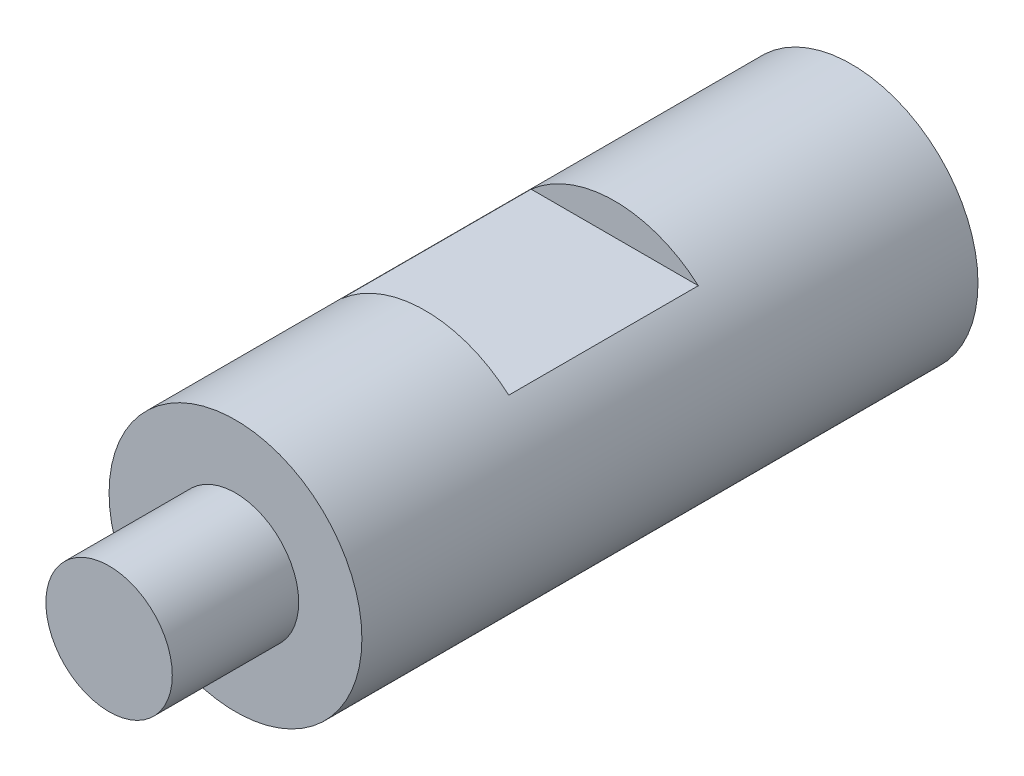
ISO-10303-21;
HEADER;
FILE_DESCRIPTION(('STEP AP214'),'2;1');
FILE_NAME('part.step','',(''),(''),'','','');
FILE_SCHEMA(('AUTOMOTIVE_DESIGN { 1 0 10303 214 1 1 1 1 }'));
ENDSEC;
DATA;
#1=APPLICATION_CONTEXT('core data for automotive mechanical design processes');
#2=APPLICATION_PROTOCOL_DEFINITION('international standard','automotive_design',2000,#1);
#3=PRODUCT_CONTEXT('',#1,'mechanical');
#4=PRODUCT('Part','Part','',(#3));
#5=PRODUCT_RELATED_PRODUCT_CATEGORY('part','',(#4));
#6=PRODUCT_DEFINITION_FORMATION('','',#4);
#7=PRODUCT_DEFINITION_CONTEXT('part definition',#1,'design');
#8=PRODUCT_DEFINITION('design','',#6,#7);
#9=PRODUCT_DEFINITION_SHAPE('','',#8);
#10=(LENGTH_UNIT() NAMED_UNIT(*) SI_UNIT(.MILLI.,.METRE.));
#11=(NAMED_UNIT(*) PLANE_ANGLE_UNIT() SI_UNIT($,.RADIAN.));
#12=(NAMED_UNIT(*) SI_UNIT($,.STERADIAN.) SOLID_ANGLE_UNIT());
#13=UNCERTAINTY_MEASURE_WITH_UNIT(LENGTH_MEASURE(1.E-05),#10,'distance_accuracy_value','');
#14=(GEOMETRIC_REPRESENTATION_CONTEXT(3) GLOBAL_UNCERTAINTY_ASSIGNED_CONTEXT((#13)) GLOBAL_UNIT_ASSIGNED_CONTEXT((#10,
#11,#12)) REPRESENTATION_CONTEXT('',''));
#15=CARTESIAN_POINT('',(0.,0.,0.));
#16=DIRECTION('',(0.,0.,1.));
#17=DIRECTION('',(1.,0.,0.));
#18=AXIS2_PLACEMENT_3D('',#15,#16,#17);
#19=CARTESIAN_POINT('',(0.,0.,30.9499));
#20=DIRECTION('',(0.,0.,-1.));
#21=DIRECTION('',(-1.,0.,0.));
#22=AXIS2_PLACEMENT_3D('',#19,#20,#21);
#23=CYLINDRICAL_SURFACE('',#22,6.35);
#24=DIRECTION('',(0.,0.,-1.));
#25=VECTOR('',#24,1.);
#26=CARTESIAN_POINT('',(4.20013020631503,-4.7625,30.9499));
#27=LINE('',#26,#25);
#28=CARTESIAN_POINT('',(4.20013020631504,-4.7625,11.8999));
#29=VERTEX_POINT('',#28);
#30=CARTESIAN_POINT('',(4.20013020631504,-4.7625,21.4249));
#31=VERTEX_POINT('',#30);
#32=EDGE_CURVE('E120',#29,#31,#27,.F.);
#33=ORIENTED_EDGE('',*,*,#32,.F.);
#34=CARTESIAN_POINT('',(0.,0.,11.8999));
#35=DIRECTION('',(0.,0.,-1.));
#36=DIRECTION('',(-1.,0.,0.));
#37=AXIS2_PLACEMENT_3D('',#34,#35,#36);
#38=CIRCLE('',#37,6.35);
#39=CARTESIAN_POINT('',(-4.20013020631504,-4.7625,11.8999));
#40=VERTEX_POINT('',#39);
#41=EDGE_CURVE('E13',#29,#40,#38,.T.);
#42=ORIENTED_EDGE('',*,*,#41,.T.);
#43=DIRECTION('',(0.,0.,-1.));
#44=VECTOR('',#43,1.);
#45=CARTESIAN_POINT('',(-4.20013020631503,-4.7625,30.9499));
#46=LINE('',#45,#44);
#47=CARTESIAN_POINT('',(-4.20013020631504,-4.7625,21.4249));
#48=VERTEX_POINT('',#47);
#49=EDGE_CURVE('E64',#48,#40,#46,.T.);
#50=ORIENTED_EDGE('',*,*,#49,.F.);
#51=CARTESIAN_POINT('',(0.,0.,21.4249));
#52=DIRECTION('',(0.,0.,-1.));
#53=DIRECTION('',(-1.,0.,0.));
#54=AXIS2_PLACEMENT_3D('',#51,#52,#53);
#55=CIRCLE('',#54,6.35);
#56=EDGE_CURVE('E116',#31,#48,#55,.T.);
#57=ORIENTED_EDGE('',*,*,#56,.F.);
#58=EDGE_LOOP('',(#33,#42,#50,#57));
#59=FACE_BOUND('',#58,.T.);
#60=CARTESIAN_POINT('',(0.,0.,21.4249));
#61=DIRECTION('',(0.,0.,-1.));
#62=DIRECTION('',(-1.,0.,0.));
#63=AXIS2_PLACEMENT_3D('',#60,#61,#62);
#64=CIRCLE('',#63,6.35);
#65=CARTESIAN_POINT('',(-4.20013020631504,4.7625,21.4249));
#66=VERTEX_POINT('',#65);
#67=CARTESIAN_POINT('',(4.20013020631504,4.7625,21.4249));
#68=VERTEX_POINT('',#67);
#69=EDGE_CURVE('E106',#66,#68,#64,.T.);
#70=ORIENTED_EDGE('',*,*,#69,.F.);
#71=DIRECTION('',(0.,0.,-1.));
#72=VECTOR('',#71,1.);
#73=CARTESIAN_POINT('',(-4.20013020631504,4.7625,30.9499));
#74=LINE('',#73,#72);
#75=CARTESIAN_POINT('',(-4.20013020631504,4.7625,11.8999));
#76=VERTEX_POINT('',#75);
#77=EDGE_CURVE('E110',#66,#76,#74,.T.);
#78=ORIENTED_EDGE('',*,*,#77,.T.);
#79=CARTESIAN_POINT('',(0.,0.,11.8999));
#80=DIRECTION('',(0.,0.,-1.));
#81=DIRECTION('',(-1.,0.,0.));
#82=AXIS2_PLACEMENT_3D('',#79,#80,#81);
#83=CIRCLE('',#82,6.35);
#84=CARTESIAN_POINT('',(4.20013020631504,4.7625,11.8999));
#85=VERTEX_POINT('',#84);
#86=EDGE_CURVE('E98',#76,#85,#83,.T.);
#87=ORIENTED_EDGE('',*,*,#86,.T.);
#88=DIRECTION('',(0.,0.,-1.));
#89=VECTOR('',#88,1.);
#90=CARTESIAN_POINT('',(4.20013020631504,4.7625,30.9499));
#91=LINE('',#90,#89);
#92=EDGE_CURVE('E107',#85,#68,#91,.F.);
#93=ORIENTED_EDGE('',*,*,#92,.T.);
#94=EDGE_LOOP('',(#70,#78,#87,#93));
#95=FACE_BOUND('',#94,.T.);
#96=CARTESIAN_POINT('',(0.,0.,30.9499));
#97=DIRECTION('',(0.,0.,1.));
#98=DIRECTION('',(1.,0.,0.));
#99=AXIS2_PLACEMENT_3D('',#96,#97,#98);
#100=CIRCLE('',#99,6.35);
#101=CARTESIAN_POINT('',(6.35,0.,30.9499));
#102=VERTEX_POINT('',#101);
#103=EDGE_CURVE('E157',#102,#102,#100,.T.);
#104=ORIENTED_EDGE('',*,*,#103,.F.);
#105=EDGE_LOOP('',(#104));
#106=FACE_BOUND('',#105,.T.);
#107=CARTESIAN_POINT('',(0.,0.,0.));
#108=DIRECTION('',(0.,0.,1.));
#109=DIRECTION('',(1.,0.,0.));
#110=AXIS2_PLACEMENT_3D('',#107,#108,#109);
#111=CIRCLE('',#110,6.35);
#112=CARTESIAN_POINT('',(6.35,0.,0.));
#113=VERTEX_POINT('',#112);
#114=EDGE_CURVE('E165',#113,#113,#111,.T.);
#115=ORIENTED_EDGE('',*,*,#114,.T.);
#116=EDGE_LOOP('',(#115));
#117=FACE_BOUND('',#116,.T.);
#118=ADVANCED_FACE('F56',(#59,#95,#106,#117),#23,.T.);
#119=CARTESIAN_POINT('',(0.,0.,30.9499));
#120=DIRECTION('',(0.,0.,1.));
#121=DIRECTION('',(1.,0.,0.));
#122=AXIS2_PLACEMENT_3D('',#119,#120,#121);
#123=PLANE('',#122);
#124=CARTESIAN_POINT('',(0.,0.,30.9499));
#125=DIRECTION('',(0.,0.,1.));
#126=DIRECTION('',(1.,0.,0.));
#127=AXIS2_PLACEMENT_3D('',#124,#125,#126);
#128=CIRCLE('',#127,3.175);
#129=CARTESIAN_POINT('',(3.175,0.,30.9499));
#130=VERTEX_POINT('',#129);
#131=EDGE_CURVE('E153',#130,#130,#128,.T.);
#132=ORIENTED_EDGE('',*,*,#131,.F.);
#133=EDGE_LOOP('',(#132));
#134=FACE_BOUND('',#133,.T.);
#135=ORIENTED_EDGE('',*,*,#103,.T.);
#136=EDGE_LOOP('',(#135));
#137=FACE_BOUND('',#136,.T.);
#138=ADVANCED_FACE('F179',(#134,#137),#123,.T.);
#139=CARTESIAN_POINT('',(0.,0.,0.));
#140=DIRECTION('',(0.,0.,1.));
#141=DIRECTION('',(1.,0.,0.));
#142=AXIS2_PLACEMENT_3D('',#139,#140,#141);
#143=PLANE('',#142);
#144=CARTESIAN_POINT('',(0.,0.,0.));
#145=DIRECTION('',(0.,0.,-1.));
#146=DIRECTION('',(-1.,0.,0.));
#147=AXIS2_PLACEMENT_3D('',#144,#145,#146);
#148=CIRCLE('',#147,2.55269999999999);
#149=CARTESIAN_POINT('',(-2.55269999999999,0.,0.));
#150=VERTEX_POINT('',#149);
#151=EDGE_CURVE('E152',#150,#150,#148,.T.);
#152=ORIENTED_EDGE('',*,*,#151,.F.);
#153=EDGE_LOOP('',(#152));
#154=FACE_BOUND('',#153,.T.);
#155=ORIENTED_EDGE('',*,*,#114,.F.);
#156=EDGE_LOOP('',(#155));
#157=FACE_BOUND('',#156,.T.);
#158=ADVANCED_FACE('F176',(#154,#157),#143,.F.);
#159=CARTESIAN_POINT('',(0.,0.,12.7));
#160=DIRECTION('',(0.,0.,-1.));
#161=DIRECTION('',(-1.,0.,0.));
#162=AXIS2_PLACEMENT_3D('',#159,#160,#161);
#163=CONICAL_SURFACE('',#162,2.5527,1.02974425867665);
#164=CARTESIAN_POINT('',(0.,0.,14.2338169021917));
#165=VERTEX_POINT('',#164);
#166=VERTEX_LOOP('',#165);
#167=FACE_BOUND('',#166,.T.);
#168=CARTESIAN_POINT('',(0.,0.,12.7));
#169=DIRECTION('',(0.,0.,-1.));
#170=DIRECTION('',(-1.,0.,0.));
#171=AXIS2_PLACEMENT_3D('',#168,#169,#170);
#172=CIRCLE('',#171,2.5527);
#173=CARTESIAN_POINT('',(-2.5527,0.,12.7));
#174=VERTEX_POINT('',#173);
#175=EDGE_CURVE('E161',#174,#174,#172,.T.);
#176=ORIENTED_EDGE('',*,*,#175,.T.);
#177=EDGE_LOOP('',(#176));
#178=FACE_BOUND('',#177,.T.);
#179=ADVANCED_FACE('F178',(#167,#178),#163,.F.);
#180=CARTESIAN_POINT('',(0.,0.,0.));
#181=DIRECTION('',(0.,0.,-1.));
#182=DIRECTION('',(-1.,0.,0.));
#183=AXIS2_PLACEMENT_3D('',#180,#181,#182);
#184=CYLINDRICAL_SURFACE('',#183,2.55269999999999);
#185=ORIENTED_EDGE('',*,*,#175,.F.);
#186=EDGE_LOOP('',(#185));
#187=FACE_BOUND('',#186,.T.);
#188=ORIENTED_EDGE('',*,*,#151,.T.);
#189=EDGE_LOOP('',(#188));
#190=FACE_BOUND('',#189,.T.);
#191=ADVANCED_FACE('F184',(#187,#190),#184,.F.);
#192=CARTESIAN_POINT('',(0.,0.,37.2999));
#193=DIRECTION('',(0.,0.,-1.));
#194=DIRECTION('',(-1.,0.,0.));
#195=AXIS2_PLACEMENT_3D('',#192,#193,#194);
#196=CYLINDRICAL_SURFACE('',#195,3.175);
#197=CARTESIAN_POINT('',(0.,0.,37.2999));
#198=DIRECTION('',(0.,0.,1.));
#199=DIRECTION('',(1.,0.,0.));
#200=AXIS2_PLACEMENT_3D('',#197,#198,#199);
#201=CIRCLE('',#200,3.175);
#202=CARTESIAN_POINT('',(3.175,0.,37.2999));
#203=VERTEX_POINT('',#202);
#204=EDGE_CURVE('E140',#203,#203,#201,.T.);
#205=ORIENTED_EDGE('',*,*,#204,.F.);
#206=EDGE_LOOP('',(#205));
#207=FACE_BOUND('',#206,.T.);
#208=ORIENTED_EDGE('',*,*,#131,.T.);
#209=EDGE_LOOP('',(#208));
#210=FACE_BOUND('',#209,.T.);
#211=ADVANCED_FACE('F255',(#207,#210),#196,.T.);
#212=CARTESIAN_POINT('',(0.,0.,37.2999));
#213=DIRECTION('',(0.,0.,1.));
#214=DIRECTION('',(1.,0.,0.));
#215=AXIS2_PLACEMENT_3D('',#212,#213,#214);
#216=PLANE('',#215);
#217=ORIENTED_EDGE('',*,*,#204,.T.);
#218=EDGE_LOOP('',(#217));
#219=FACE_BOUND('',#218,.T.);
#220=ADVANCED_FACE('F199',(#219),#216,.T.);
#221=CARTESIAN_POINT('',(-6.35,0.,21.4249));
#222=DIRECTION('',(0.,0.,-1.));
#223=DIRECTION('',(-1.,0.,0.));
#224=AXIS2_PLACEMENT_3D('',#221,#222,#223);
#225=PLANE('',#224);
#226=DIRECTION('',(1.,0.,0.));
#227=VECTOR('',#226,1.);
#228=CARTESIAN_POINT('',(-6.35,4.7625,21.4249));
#229=LINE('',#228,#227);
#230=EDGE_CURVE('E71',#66,#68,#229,.T.);
#231=ORIENTED_EDGE('',*,*,#230,.F.);
#232=ORIENTED_EDGE('',*,*,#69,.T.);
#233=EDGE_LOOP('',(#231,#232));
#234=FACE_BOUND('',#233,.T.);
#235=ADVANCED_FACE('F203',(#234),#225,.T.);
#236=CARTESIAN_POINT('',(-6.35,0.,11.8999));
#237=DIRECTION('',(0.,0.,-1.));
#238=DIRECTION('',(-1.,0.,0.));
#239=AXIS2_PLACEMENT_3D('',#236,#237,#238);
#240=PLANE('',#239);
#241=DIRECTION('',(1.,0.,0.));
#242=VECTOR('',#241,1.);
#243=CARTESIAN_POINT('',(-6.35,4.7625,11.8999));
#244=LINE('',#243,#242);
#245=EDGE_CURVE('E101',#76,#85,#244,.T.);
#246=ORIENTED_EDGE('',*,*,#245,.T.);
#247=ORIENTED_EDGE('',*,*,#86,.F.);
#248=EDGE_LOOP('',(#246,#247));
#249=FACE_BOUND('',#248,.T.);
#250=ADVANCED_FACE('F100',(#249),#240,.F.);
#251=CARTESIAN_POINT('',(-6.35,4.76250000000001,0.));
#252=DIRECTION('',(0.,-1.,0.));
#253=DIRECTION('',(0.,0.,-1.));
#254=AXIS2_PLACEMENT_3D('',#251,#252,#253);
#255=PLANE('',#254);
#256=ORIENTED_EDGE('',*,*,#230,.T.);
#257=ORIENTED_EDGE('',*,*,#92,.F.);
#258=ORIENTED_EDGE('',*,*,#245,.F.);
#259=ORIENTED_EDGE('',*,*,#77,.F.);
#260=EDGE_LOOP('',(#256,#257,#258,#259));
#261=FACE_BOUND('',#260,.T.);
#262=ADVANCED_FACE('F109',(#261),#255,.F.);
#263=CARTESIAN_POINT('',(-6.35,-4.76249999999999,0.));
#264=DIRECTION('',(0.,-1.,0.));
#265=DIRECTION('',(0.,0.,-1.));
#266=AXIS2_PLACEMENT_3D('',#263,#264,#265);
#267=PLANE('',#266);
#268=ORIENTED_EDGE('',*,*,#49,.T.);
#269=DIRECTION('',(1.,0.,0.));
#270=VECTOR('',#269,1.);
#271=CARTESIAN_POINT('',(-6.35,-4.7625,11.8999));
#272=LINE('',#271,#270);
#273=EDGE_CURVE('E133',#40,#29,#272,.T.);
#274=ORIENTED_EDGE('',*,*,#273,.T.);
#275=ORIENTED_EDGE('',*,*,#32,.T.);
#276=DIRECTION('',(1.,0.,0.));
#277=VECTOR('',#276,1.);
#278=CARTESIAN_POINT('',(-6.35,-4.7625,21.4249));
#279=LINE('',#278,#277);
#280=EDGE_CURVE('E112',#48,#31,#279,.T.);
#281=ORIENTED_EDGE('',*,*,#280,.F.);
#282=EDGE_LOOP('',(#268,#274,#275,#281));
#283=FACE_BOUND('',#282,.T.);
#284=ADVANCED_FACE('F132',(#283),#267,.T.);
#285=CARTESIAN_POINT('',(-6.35,0.,11.8999));
#286=DIRECTION('',(0.,0.,-1.));
#287=DIRECTION('',(-1.,0.,0.));
#288=AXIS2_PLACEMENT_3D('',#285,#286,#287);
#289=PLANE('',#288);
#290=ORIENTED_EDGE('',*,*,#273,.F.);
#291=ORIENTED_EDGE('',*,*,#41,.F.);
#292=EDGE_LOOP('',(#290,#291));
#293=FACE_BOUND('',#292,.T.);
#294=ADVANCED_FACE('F138',(#293),#289,.F.);
#295=CARTESIAN_POINT('',(-6.35,0.,21.4249));
#296=DIRECTION('',(0.,0.,-1.));
#297=DIRECTION('',(-1.,0.,0.));
#298=AXIS2_PLACEMENT_3D('',#295,#296,#297);
#299=PLANE('',#298);
#300=ORIENTED_EDGE('',*,*,#280,.T.);
#301=ORIENTED_EDGE('',*,*,#56,.T.);
#302=EDGE_LOOP('',(#300,#301));
#303=FACE_BOUND('',#302,.T.);
#304=ADVANCED_FACE('F143',(#303),#299,.T.);
#305=CLOSED_SHELL('',(#118,#138,#158,#179,#191,#211,#220,#235,#250,#262,#284,#294,#304));
#306=MANIFOLD_SOLID_BREP('B2',#305);
#307=ADVANCED_BREP_SHAPE_REPRESENTATION('',(#18,#306),#14);
#308=SHAPE_DEFINITION_REPRESENTATION(#9,#307);
ENDSEC;
END-ISO-10303-21;
